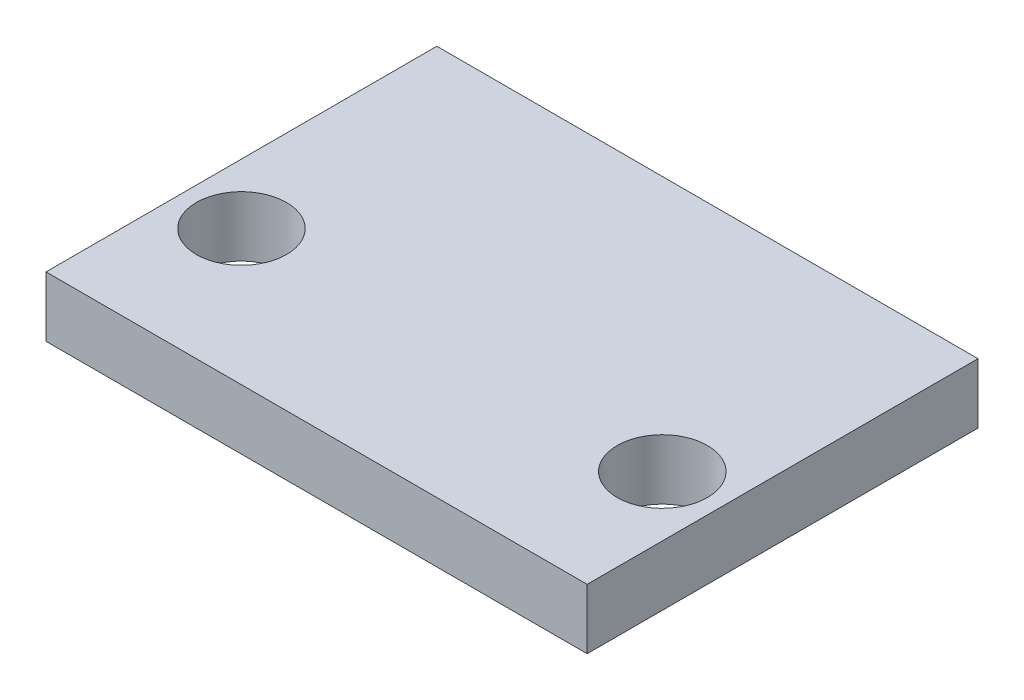
ISO-10303-21;
HEADER;
FILE_DESCRIPTION(('STEP AP214'),'2;1');
FILE_NAME('part.step','',(''),(''),'','','');
FILE_SCHEMA(('AUTOMOTIVE_DESIGN { 1 0 10303 214 1 1 1 1 }'));
ENDSEC;
DATA;
#1=APPLICATION_CONTEXT('core data for automotive mechanical design processes');
#2=APPLICATION_PROTOCOL_DEFINITION('international standard','automotive_design',2000,#1);
#3=PRODUCT_CONTEXT('',#1,'mechanical');
#4=PRODUCT('Part','Part','',(#3));
#5=PRODUCT_RELATED_PRODUCT_CATEGORY('part','',(#4));
#6=PRODUCT_DEFINITION_FORMATION('','',#4);
#7=PRODUCT_DEFINITION_CONTEXT('part definition',#1,'design');
#8=PRODUCT_DEFINITION('design','',#6,#7);
#9=PRODUCT_DEFINITION_SHAPE('','',#8);
#10=(LENGTH_UNIT() NAMED_UNIT(*) SI_UNIT(.MILLI.,.METRE.));
#11=(NAMED_UNIT(*) PLANE_ANGLE_UNIT() SI_UNIT($,.RADIAN.));
#12=(NAMED_UNIT(*) SI_UNIT($,.STERADIAN.) SOLID_ANGLE_UNIT());
#13=UNCERTAINTY_MEASURE_WITH_UNIT(LENGTH_MEASURE(1.E-05),#10,'distance_accuracy_value','');
#14=(GEOMETRIC_REPRESENTATION_CONTEXT(3) GLOBAL_UNCERTAINTY_ASSIGNED_CONTEXT((#13)) GLOBAL_UNIT_ASSIGNED_CONTEXT((#10,
#11,#12)) REPRESENTATION_CONTEXT('',''));
#15=CARTESIAN_POINT('',(0.,0.,0.));
#16=DIRECTION('',(0.,0.,1.));
#17=DIRECTION('',(1.,0.,0.));
#18=AXIS2_PLACEMENT_3D('',#15,#16,#17);
#19=CARTESIAN_POINT('',(0.,2.,0.));
#20=DIRECTION('',(1.,0.,0.));
#21=DIRECTION('',(0.,0.,-1.));
#22=AXIS2_PLACEMENT_3D('',#19,#20,#21);
#23=PLANE('',#22);
#24=DIRECTION('',(0.,0.,1.));
#25=VECTOR('',#24,1.);
#26=CARTESIAN_POINT('',(0.,0.,0.));
#27=LINE('',#26,#25);
#28=CARTESIAN_POINT('',(0.,0.,0.));
#29=VERTEX_POINT('',#28);
#30=CARTESIAN_POINT('',(0.,0.,13.));
#31=VERTEX_POINT('',#30);
#32=EDGE_CURVE('E102',#29,#31,#27,.T.);
#33=ORIENTED_EDGE('',*,*,#32,.T.);
#34=DIRECTION('',(0.,-1.,0.));
#35=VECTOR('',#34,1.);
#36=CARTESIAN_POINT('',(0.,2.,13.));
#37=LINE('',#36,#35);
#38=CARTESIAN_POINT('',(0.,2.,13.));
#39=VERTEX_POINT('',#38);
#40=EDGE_CURVE('E11',#39,#31,#37,.T.);
#41=ORIENTED_EDGE('',*,*,#40,.F.);
#42=DIRECTION('',(0.,0.,1.));
#43=VECTOR('',#42,1.);
#44=CARTESIAN_POINT('',(0.,2.,0.));
#45=LINE('',#44,#43);
#46=CARTESIAN_POINT('',(0.,2.,0.));
#47=VERTEX_POINT('',#46);
#48=EDGE_CURVE('E90',#47,#39,#45,.T.);
#49=ORIENTED_EDGE('',*,*,#48,.F.);
#50=DIRECTION('',(0.,-1.,0.));
#51=VECTOR('',#50,1.);
#52=CARTESIAN_POINT('',(0.,2.,0.));
#53=LINE('',#52,#51);
#54=EDGE_CURVE('E98',#47,#29,#53,.T.);
#55=ORIENTED_EDGE('',*,*,#54,.T.);
#56=EDGE_LOOP('',(#33,#41,#49,#55));
#57=FACE_BOUND('',#56,.T.);
#58=ADVANCED_FACE('F39',(#57),#23,.F.);
#59=CARTESIAN_POINT('',(0.,2.,13.));
#60=DIRECTION('',(0.,0.,-1.));
#61=DIRECTION('',(-1.,0.,0.));
#62=AXIS2_PLACEMENT_3D('',#59,#60,#61);
#63=PLANE('',#62);
#64=DIRECTION('',(1.,0.,0.));
#65=VECTOR('',#64,1.);
#66=CARTESIAN_POINT('',(0.,0.,13.));
#67=LINE('',#66,#65);
#68=CARTESIAN_POINT('',(18.,0.,13.));
#69=VERTEX_POINT('',#68);
#70=EDGE_CURVE('E94',#31,#69,#67,.T.);
#71=ORIENTED_EDGE('',*,*,#70,.T.);
#72=DIRECTION('',(0.,-1.,0.));
#73=VECTOR('',#72,1.);
#74=CARTESIAN_POINT('',(18.,2.,13.));
#75=LINE('',#74,#73);
#76=CARTESIAN_POINT('',(18.,2.,13.));
#77=VERTEX_POINT('',#76);
#78=EDGE_CURVE('E47',#77,#69,#75,.T.);
#79=ORIENTED_EDGE('',*,*,#78,.F.);
#80=DIRECTION('',(1.,0.,0.));
#81=VECTOR('',#80,1.);
#82=CARTESIAN_POINT('',(0.,2.,13.));
#83=LINE('',#82,#81);
#84=EDGE_CURVE('E85',#39,#77,#83,.T.);
#85=ORIENTED_EDGE('',*,*,#84,.F.);
#86=ORIENTED_EDGE('',*,*,#40,.T.);
#87=EDGE_LOOP('',(#71,#79,#85,#86));
#88=FACE_BOUND('',#87,.T.);
#89=ADVANCED_FACE('F93',(#88),#63,.F.);
#90=CARTESIAN_POINT('',(18.,2.,0.));
#91=DIRECTION('',(-1.,0.,0.));
#92=DIRECTION('',(0.,0.,1.));
#93=AXIS2_PLACEMENT_3D('',#90,#91,#92);
#94=PLANE('',#93);
#95=DIRECTION('',(0.,0.,-1.));
#96=VECTOR('',#95,1.);
#97=CARTESIAN_POINT('',(18.,0.,0.));
#98=LINE('',#97,#96);
#99=CARTESIAN_POINT('',(18.,0.,0.));
#100=VERTEX_POINT('',#99);
#101=EDGE_CURVE('E72',#69,#100,#98,.T.);
#102=ORIENTED_EDGE('',*,*,#101,.T.);
#103=DIRECTION('',(0.,-1.,0.));
#104=VECTOR('',#103,1.);
#105=CARTESIAN_POINT('',(18.,2.,0.));
#106=LINE('',#105,#104);
#107=CARTESIAN_POINT('',(18.,2.,0.));
#108=VERTEX_POINT('',#107);
#109=EDGE_CURVE('E95',#108,#100,#106,.T.);
#110=ORIENTED_EDGE('',*,*,#109,.F.);
#111=DIRECTION('',(0.,0.,-1.));
#112=VECTOR('',#111,1.);
#113=CARTESIAN_POINT('',(18.,2.,0.));
#114=LINE('',#113,#112);
#115=EDGE_CURVE('E88',#77,#108,#114,.T.);
#116=ORIENTED_EDGE('',*,*,#115,.F.);
#117=ORIENTED_EDGE('',*,*,#78,.T.);
#118=EDGE_LOOP('',(#102,#110,#116,#117));
#119=FACE_BOUND('',#118,.T.);
#120=ADVANCED_FACE('F96',(#119),#94,.F.);
#121=CARTESIAN_POINT('',(0.,2.,0.));
#122=DIRECTION('',(0.,0.,1.));
#123=DIRECTION('',(1.,0.,0.));
#124=AXIS2_PLACEMENT_3D('',#121,#122,#123);
#125=PLANE('',#124);
#126=DIRECTION('',(-1.,0.,0.));
#127=VECTOR('',#126,1.);
#128=CARTESIAN_POINT('',(0.,0.,0.));
#129=LINE('',#128,#127);
#130=EDGE_CURVE('E78',#100,#29,#129,.T.);
#131=ORIENTED_EDGE('',*,*,#130,.T.);
#132=ORIENTED_EDGE('',*,*,#54,.F.);
#133=DIRECTION('',(-1.,0.,0.));
#134=VECTOR('',#133,1.);
#135=CARTESIAN_POINT('',(0.,2.,0.));
#136=LINE('',#135,#134);
#137=EDGE_CURVE('E55',#108,#47,#136,.T.);
#138=ORIENTED_EDGE('',*,*,#137,.F.);
#139=ORIENTED_EDGE('',*,*,#109,.T.);
#140=EDGE_LOOP('',(#131,#132,#138,#139));
#141=FACE_BOUND('',#140,.T.);
#142=ADVANCED_FACE('F110',(#141),#125,.F.);
#143=CARTESIAN_POINT('',(0.,2.,0.));
#144=DIRECTION('',(0.,1.,0.));
#145=DIRECTION('',(0.,0.,1.));
#146=AXIS2_PLACEMENT_3D('',#143,#144,#145);
#147=PLANE('',#146);
#148=CARTESIAN_POINT('',(2.,2.,8.5));
#149=DIRECTION('',(0.,1.,0.));
#150=DIRECTION('',(0.,0.,1.));
#151=AXIS2_PLACEMENT_3D('',#148,#149,#150);
#152=CIRCLE('',#151,1.5);
#153=CARTESIAN_POINT('',(2.,2.,10.));
#154=VERTEX_POINT('',#153);
#155=EDGE_CURVE('E105',#154,#154,#152,.T.);
#156=ORIENTED_EDGE('',*,*,#155,.F.);
#157=EDGE_LOOP('',(#156));
#158=FACE_BOUND('',#157,.T.);
#159=CARTESIAN_POINT('',(16.,2.,8.5));
#160=DIRECTION('',(0.,1.,0.));
#161=DIRECTION('',(0.,0.,1.));
#162=AXIS2_PLACEMENT_3D('',#159,#160,#161);
#163=CIRCLE('',#162,1.5);
#164=CARTESIAN_POINT('',(16.,2.,10.));
#165=VERTEX_POINT('',#164);
#166=EDGE_CURVE('E118',#165,#165,#163,.T.);
#167=ORIENTED_EDGE('',*,*,#166,.F.);
#168=EDGE_LOOP('',(#167));
#169=FACE_BOUND('',#168,.T.);
#170=ORIENTED_EDGE('',*,*,#48,.T.);
#171=ORIENTED_EDGE('',*,*,#84,.T.);
#172=ORIENTED_EDGE('',*,*,#115,.T.);
#173=ORIENTED_EDGE('',*,*,#137,.T.);
#174=EDGE_LOOP('',(#170,#171,#172,#173));
#175=FACE_BOUND('',#174,.T.);
#176=ADVANCED_FACE('F86',(#158,#169,#175),#147,.T.);
#177=CARTESIAN_POINT('',(0.,0.,0.));
#178=DIRECTION('',(0.,1.,0.));
#179=DIRECTION('',(0.,0.,1.));
#180=AXIS2_PLACEMENT_3D('',#177,#178,#179);
#181=PLANE('',#180);
#182=CARTESIAN_POINT('',(2.,0.,8.5));
#183=DIRECTION('',(0.,-1.,0.));
#184=DIRECTION('',(0.,0.,-1.));
#185=AXIS2_PLACEMENT_3D('',#182,#183,#184);
#186=CIRCLE('',#185,1.5);
#187=CARTESIAN_POINT('',(2.,0.,7.));
#188=VERTEX_POINT('',#187);
#189=EDGE_CURVE('E121',#188,#188,#186,.T.);
#190=ORIENTED_EDGE('',*,*,#189,.F.);
#191=EDGE_LOOP('',(#190));
#192=FACE_BOUND('',#191,.T.);
#193=CARTESIAN_POINT('',(16.,0.,8.5));
#194=DIRECTION('',(0.,-1.,0.));
#195=DIRECTION('',(0.,0.,1.));
#196=AXIS2_PLACEMENT_3D('',#193,#194,#195);
#197=CIRCLE('',#196,1.5);
#198=CARTESIAN_POINT('',(16.,0.,10.));
#199=VERTEX_POINT('',#198);
#200=EDGE_CURVE('E122',#199,#199,#197,.T.);
#201=ORIENTED_EDGE('',*,*,#200,.F.);
#202=EDGE_LOOP('',(#201));
#203=FACE_BOUND('',#202,.T.);
#204=ORIENTED_EDGE('',*,*,#32,.F.);
#205=ORIENTED_EDGE('',*,*,#130,.F.);
#206=ORIENTED_EDGE('',*,*,#101,.F.);
#207=ORIENTED_EDGE('',*,*,#70,.F.);
#208=EDGE_LOOP('',(#204,#205,#206,#207));
#209=FACE_BOUND('',#208,.T.);
#210=ADVANCED_FACE('F113',(#192,#203,#209),#181,.F.);
#211=CARTESIAN_POINT('',(16.,8.,8.5));
#212=DIRECTION('',(0.,-1.,0.));
#213=DIRECTION('',(0.,0.,-1.));
#214=AXIS2_PLACEMENT_3D('',#211,#212,#213);
#215=CYLINDRICAL_SURFACE('',#214,1.5);
#216=ORIENTED_EDGE('',*,*,#166,.T.);
#217=EDGE_LOOP('',(#216));
#218=FACE_BOUND('',#217,.T.);
#219=ORIENTED_EDGE('',*,*,#200,.T.);
#220=EDGE_LOOP('',(#219));
#221=FACE_BOUND('',#220,.T.);
#222=ADVANCED_FACE('F132',(#218,#221),#215,.F.);
#223=CARTESIAN_POINT('',(2.,8.,8.5));
#224=DIRECTION('',(0.,-1.,0.));
#225=DIRECTION('',(0.,0.,-1.));
#226=AXIS2_PLACEMENT_3D('',#223,#224,#225);
#227=CYLINDRICAL_SURFACE('',#226,1.5);
#228=ORIENTED_EDGE('',*,*,#155,.T.);
#229=EDGE_LOOP('',(#228));
#230=FACE_BOUND('',#229,.T.);
#231=ORIENTED_EDGE('',*,*,#189,.T.);
#232=EDGE_LOOP('',(#231));
#233=FACE_BOUND('',#232,.T.);
#234=ADVANCED_FACE('F128',(#230,#233),#227,.F.);
#235=CLOSED_SHELL('',(#58,#89,#120,#142,#176,#210,#222,#234));
#236=MANIFOLD_SOLID_BREP('B2',#235);
#237=ADVANCED_BREP_SHAPE_REPRESENTATION('',(#18,#236),#14);
#238=SHAPE_DEFINITION_REPRESENTATION(#9,#237);
ENDSEC;
END-ISO-10303-21;
